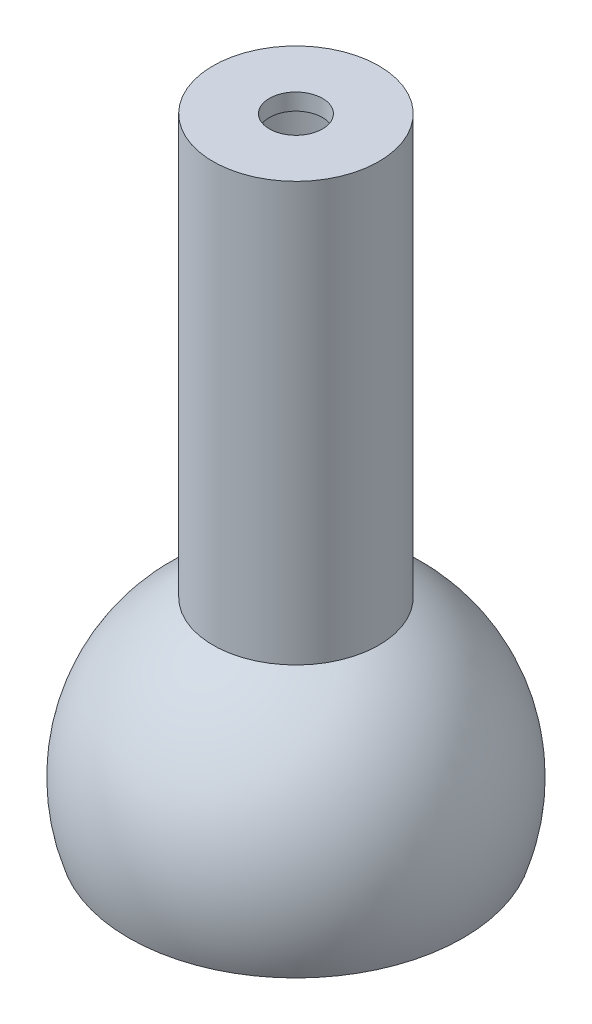
ISO-10303-21;
HEADER;
FILE_DESCRIPTION(('STEP AP214'),'2;1');
FILE_NAME('part.step','',(''),(''),'','','');
FILE_SCHEMA(('AUTOMOTIVE_DESIGN { 1 0 10303 214 1 1 1 1 }'));
ENDSEC;
DATA;
#1=APPLICATION_CONTEXT('core data for automotive mechanical design processes');
#2=APPLICATION_PROTOCOL_DEFINITION('international standard','automotive_design',2000,#1);
#3=PRODUCT_CONTEXT('',#1,'mechanical');
#4=PRODUCT('Part','Part','',(#3));
#5=PRODUCT_RELATED_PRODUCT_CATEGORY('part','',(#4));
#6=PRODUCT_DEFINITION_FORMATION('','',#4);
#7=PRODUCT_DEFINITION_CONTEXT('part definition',#1,'design');
#8=PRODUCT_DEFINITION('design','',#6,#7);
#9=PRODUCT_DEFINITION_SHAPE('','',#8);
#10=(LENGTH_UNIT() NAMED_UNIT(*) SI_UNIT(.MILLI.,.METRE.));
#11=(NAMED_UNIT(*) PLANE_ANGLE_UNIT() SI_UNIT($,.RADIAN.));
#12=(NAMED_UNIT(*) SI_UNIT($,.STERADIAN.) SOLID_ANGLE_UNIT());
#13=UNCERTAINTY_MEASURE_WITH_UNIT(LENGTH_MEASURE(1.E-05),#10,'distance_accuracy_value','');
#14=(GEOMETRIC_REPRESENTATION_CONTEXT(3) GLOBAL_UNCERTAINTY_ASSIGNED_CONTEXT((#13)) GLOBAL_UNIT_ASSIGNED_CONTEXT((#10,
#11,#12)) REPRESENTATION_CONTEXT('',''));
#15=CARTESIAN_POINT('',(0.,0.,0.));
#16=DIRECTION('',(0.,0.,1.));
#17=DIRECTION('',(1.,0.,0.));
#18=AXIS2_PLACEMENT_3D('',#15,#16,#17);
#19=CARTESIAN_POINT('',(0.,6.,0.));
#20=DIRECTION('',(0.,-1.,0.));
#21=DIRECTION('',(0.,0.,-1.));
#22=AXIS2_PLACEMENT_3D('',#19,#20,#21);
#23=PLANE('',#22);
#24=CARTESIAN_POINT('',(0.,6.,0.));
#25=DIRECTION('',(0.,-1.,0.));
#26=DIRECTION('',(0.,0.,-1.));
#27=AXIS2_PLACEMENT_3D('',#24,#25,#26);
#28=CIRCLE('',#27,10.0747208398049);
#29=CARTESIAN_POINT('',(0.,6.,-10.0747208398049));
#30=VERTEX_POINT('',#29);
#31=EDGE_CURVE('E39',#30,#30,#28,.F.);
#32=ORIENTED_EDGE('',*,*,#31,.F.);
#33=EDGE_LOOP('',(#32));
#34=FACE_BOUND('',#33,.T.);
#35=CARTESIAN_POINT('',(0.,6.,0.));
#36=DIRECTION('',(0.,-1.,0.));
#37=DIRECTION('',(0.,0.,-1.));
#38=AXIS2_PLACEMENT_3D('',#35,#36,#37);
#39=CIRCLE('',#38,9.01387818865997);
#40=CARTESIAN_POINT('',(0.,6.,-9.01387818865997));
#41=VERTEX_POINT('',#40);
#42=EDGE_CURVE('E49',#41,#41,#39,.F.);
#43=ORIENTED_EDGE('',*,*,#42,.T.);
#44=EDGE_LOOP('',(#43));
#45=FACE_BOUND('',#44,.T.);
#46=ADVANCED_FACE('F35',(#34,#45),#23,.T.);
#47=CARTESIAN_POINT('',(0.,9.375,0.));
#48=DIRECTION('',(0.,0.,1.));
#49=DIRECTION('',(1.,0.,0.));
#50=AXIS2_PLACEMENT_3D('',#47,#48,#49);
#51=SPHERICAL_SURFACE('',#50,10.625);
#52=CARTESIAN_POINT('',(0.,9.375,0.));
#53=DIRECTION('',(0.,-1.,0.));
#54=DIRECTION('',(0.,0.,-1.));
#55=AXIS2_PLACEMENT_3D('',#52,#53,#54);
#56=SPHERICAL_SURFACE('',#55,10.625);
#57=CARTESIAN_POINT('',(0.,18.75,0.));
#58=DIRECTION('',(0.,-1.,0.));
#59=DIRECTION('',(0.,0.,-1.));
#60=AXIS2_PLACEMENT_3D('',#57,#58,#59);
#61=CIRCLE('',#60,5.);
#62=CARTESIAN_POINT('',(0.,18.75,-5.));
#63=VERTEX_POINT('',#62);
#64=EDGE_CURVE('E10',#63,#63,#61,.F.);
#65=ORIENTED_EDGE('',*,*,#64,.F.);
#66=EDGE_LOOP('',(#65));
#67=FACE_BOUND('',#66,.T.);
#68=ORIENTED_EDGE('',*,*,#31,.T.);
#69=EDGE_LOOP('',(#68));
#70=FACE_BOUND('',#69,.T.);
#71=ADVANCED_FACE('F37',(#67,#70),#56,.T.);
#72=CARTESIAN_POINT('',(0.,44.,0.));
#73=DIRECTION('',(0.,-1.,0.));
#74=DIRECTION('',(0.,0.,-1.));
#75=AXIS2_PLACEMENT_3D('',#72,#73,#74);
#76=CYLINDRICAL_SURFACE('',#75,5.);
#77=ORIENTED_EDGE('',*,*,#64,.T.);
#78=EDGE_LOOP('',(#77));
#79=FACE_BOUND('',#78,.T.);
#80=CARTESIAN_POINT('',(0.,44.,0.));
#81=DIRECTION('',(0.,-1.,0.));
#82=DIRECTION('',(0.,0.,-1.));
#83=AXIS2_PLACEMENT_3D('',#80,#81,#82);
#84=CIRCLE('',#83,5.);
#85=CARTESIAN_POINT('',(0.,44.,-5.));
#86=VERTEX_POINT('',#85);
#87=EDGE_CURVE('E43',#86,#86,#84,.T.);
#88=ORIENTED_EDGE('',*,*,#87,.T.);
#89=EDGE_LOOP('',(#88));
#90=FACE_BOUND('',#89,.T.);
#91=ADVANCED_FACE('F71',(#79,#90),#76,.T.);
#92=CARTESIAN_POINT('',(0.,44.,0.));
#93=DIRECTION('',(0.,-1.,0.));
#94=DIRECTION('',(0.,0.,-1.));
#95=AXIS2_PLACEMENT_3D('',#92,#93,#94);
#96=PLANE('',#95);
#97=CARTESIAN_POINT('',(0.,44.,0.));
#98=DIRECTION('',(0.,1.,0.));
#99=DIRECTION('',(0.,0.,1.));
#100=AXIS2_PLACEMENT_3D('',#97,#98,#99);
#101=CIRCLE('',#100,1.6);
#102=CARTESIAN_POINT('',(0.,44.,1.6));
#103=VERTEX_POINT('',#102);
#104=EDGE_CURVE('E53',#103,#103,#101,.T.);
#105=ORIENTED_EDGE('',*,*,#104,.F.);
#106=EDGE_LOOP('',(#105));
#107=FACE_BOUND('',#106,.T.);
#108=ORIENTED_EDGE('',*,*,#87,.F.);
#109=EDGE_LOOP('',(#108));
#110=FACE_BOUND('',#109,.T.);
#111=ADVANCED_FACE('F67',(#107,#110),#96,.F.);
#112=CARTESIAN_POINT('',(0.,9.375,0.));
#113=DIRECTION('',(0.,0.,1.));
#114=DIRECTION('',(1.,0.,0.));
#115=AXIS2_PLACEMENT_3D('',#112,#113,#114);
#116=SPHERICAL_SURFACE('',#115,9.625);
#117=CARTESIAN_POINT('',(0.,9.375,0.));
#118=DIRECTION('',(0.,-1.,0.));
#119=DIRECTION('',(0.,0.,-1.));
#120=AXIS2_PLACEMENT_3D('',#117,#118,#119);
#121=SPHERICAL_SURFACE('',#120,9.625);
#122=CARTESIAN_POINT('',(0.,18.1294631474466,0.));
#123=DIRECTION('',(0.,-1.,0.));
#124=DIRECTION('',(0.,0.,-1.));
#125=AXIS2_PLACEMENT_3D('',#122,#123,#124);
#126=CIRCLE('',#125,4.);
#127=CARTESIAN_POINT('',(0.,18.1294631474466,-4.));
#128=VERTEX_POINT('',#127);
#129=EDGE_CURVE('E56',#128,#128,#126,.F.);
#130=ORIENTED_EDGE('',*,*,#129,.T.);
#131=EDGE_LOOP('',(#130));
#132=FACE_BOUND('',#131,.T.);
#133=ORIENTED_EDGE('',*,*,#42,.F.);
#134=EDGE_LOOP('',(#133));
#135=FACE_BOUND('',#134,.T.);
#136=ADVANCED_FACE('F70',(#132,#135),#121,.F.);
#137=CARTESIAN_POINT('',(0.,44.,0.));
#138=DIRECTION('',(0.,-1.,0.));
#139=DIRECTION('',(0.,0.,-1.));
#140=AXIS2_PLACEMENT_3D('',#137,#138,#139);
#141=CYLINDRICAL_SURFACE('',#140,4.);
#142=ORIENTED_EDGE('',*,*,#129,.F.);
#143=EDGE_LOOP('',(#142));
#144=FACE_BOUND('',#143,.T.);
#145=CARTESIAN_POINT('',(0.,43.,0.));
#146=DIRECTION('',(0.,-1.,0.));
#147=DIRECTION('',(0.,0.,-1.));
#148=AXIS2_PLACEMENT_3D('',#145,#146,#147);
#149=CIRCLE('',#148,4.);
#150=CARTESIAN_POINT('',(0.,43.,-4.));
#151=VERTEX_POINT('',#150);
#152=EDGE_CURVE('E52',#151,#151,#149,.T.);
#153=ORIENTED_EDGE('',*,*,#152,.F.);
#154=EDGE_LOOP('',(#153));
#155=FACE_BOUND('',#154,.T.);
#156=ADVANCED_FACE('F91',(#144,#155),#141,.F.);
#157=CARTESIAN_POINT('',(0.,43.,0.));
#158=DIRECTION('',(0.,-1.,0.));
#159=DIRECTION('',(0.,0.,-1.));
#160=AXIS2_PLACEMENT_3D('',#157,#158,#159);
#161=PLANE('',#160);
#162=CARTESIAN_POINT('',(0.,43.,0.));
#163=DIRECTION('',(0.,-1.,0.));
#164=DIRECTION('',(0.,0.,-1.));
#165=AXIS2_PLACEMENT_3D('',#162,#163,#164);
#166=CIRCLE('',#165,1.6);
#167=CARTESIAN_POINT('',(0.,43.,-1.6));
#168=VERTEX_POINT('',#167);
#169=EDGE_CURVE('E59',#168,#168,#166,.F.);
#170=ORIENTED_EDGE('',*,*,#169,.T.);
#171=EDGE_LOOP('',(#170));
#172=FACE_BOUND('',#171,.T.);
#173=ORIENTED_EDGE('',*,*,#152,.T.);
#174=EDGE_LOOP('',(#173));
#175=FACE_BOUND('',#174,.T.);
#176=ADVANCED_FACE('F88',(#172,#175),#161,.T.);
#177=CARTESIAN_POINT('',(0.,5.999,0.));
#178=DIRECTION('',(0.,1.,0.));
#179=DIRECTION('',(0.,0.,1.));
#180=AXIS2_PLACEMENT_3D('',#177,#178,#179);
#181=CYLINDRICAL_SURFACE('',#180,1.6);
#182=ORIENTED_EDGE('',*,*,#169,.F.);
#183=EDGE_LOOP('',(#182));
#184=FACE_BOUND('',#183,.T.);
#185=ORIENTED_EDGE('',*,*,#104,.T.);
#186=EDGE_LOOP('',(#185));
#187=FACE_BOUND('',#186,.T.);
#188=ADVANCED_FACE('F65',(#184,#187),#181,.F.);
#189=CLOSED_SHELL('',(#46,#71,#91,#111,#136,#156,#176,#188));
#190=MANIFOLD_SOLID_BREP('B2',#189);
#191=ADVANCED_BREP_SHAPE_REPRESENTATION('',(#18,#190),#14);
#192=SHAPE_DEFINITION_REPRESENTATION(#9,#191);
ENDSEC;
END-ISO-10303-21;
